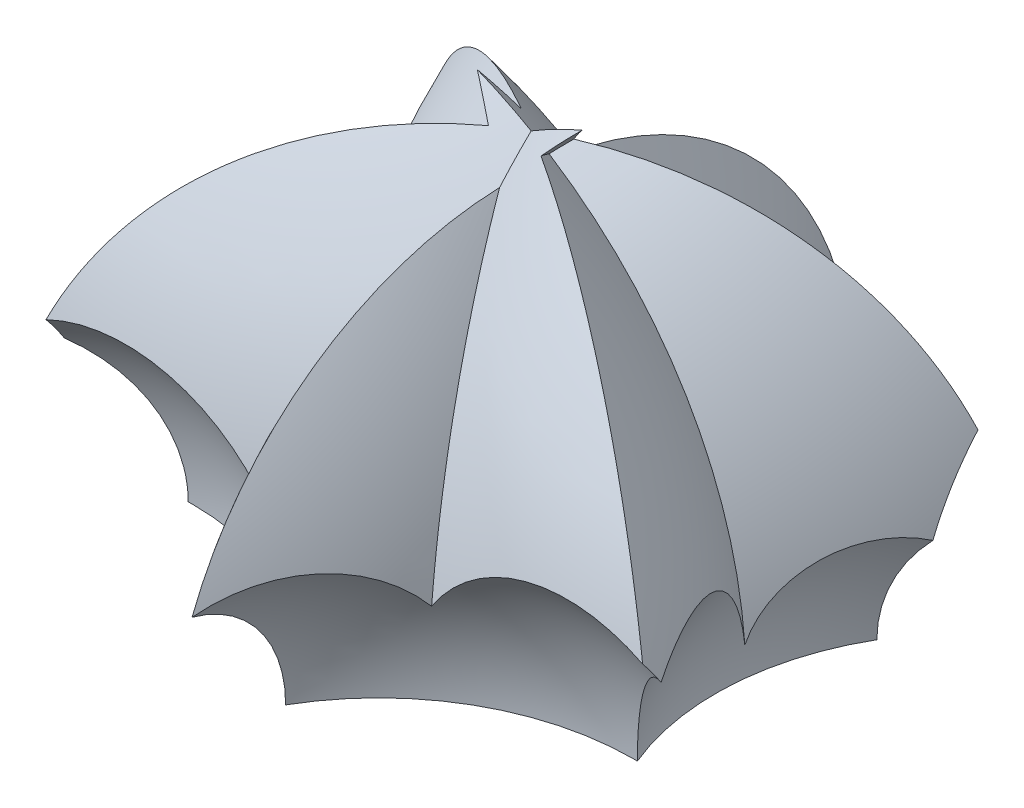
ISO-10303-21;
HEADER;
FILE_DESCRIPTION(('STEP AP214'),'2;1');
FILE_NAME('part.step','',(''),(''),'','','');
FILE_SCHEMA(('AUTOMOTIVE_DESIGN { 1 0 10303 214 1 1 1 1 }'));
ENDSEC;
DATA;
#1=APPLICATION_CONTEXT('core data for automotive mechanical design processes');
#2=APPLICATION_PROTOCOL_DEFINITION('international standard','automotive_design',2000,#1);
#3=PRODUCT_CONTEXT('',#1,'mechanical');
#4=PRODUCT('Part','Part','',(#3));
#5=PRODUCT_RELATED_PRODUCT_CATEGORY('part','',(#4));
#6=PRODUCT_DEFINITION_FORMATION('','',#4);
#7=PRODUCT_DEFINITION_CONTEXT('part definition',#1,'design');
#8=PRODUCT_DEFINITION('design','',#6,#7);
#9=PRODUCT_DEFINITION_SHAPE('','',#8);
#10=(LENGTH_UNIT() NAMED_UNIT(*) SI_UNIT(.MILLI.,.METRE.));
#11=(NAMED_UNIT(*) PLANE_ANGLE_UNIT() SI_UNIT($,.RADIAN.));
#12=(NAMED_UNIT(*) SI_UNIT($,.STERADIAN.) SOLID_ANGLE_UNIT());
#13=UNCERTAINTY_MEASURE_WITH_UNIT(LENGTH_MEASURE(1.E-05),#10,'distance_accuracy_value','');
#14=(GEOMETRIC_REPRESENTATION_CONTEXT(3) GLOBAL_UNCERTAINTY_ASSIGNED_CONTEXT((#13)) GLOBAL_UNIT_ASSIGNED_CONTEXT((#10,
#11,#12)) REPRESENTATION_CONTEXT('',''));
#15=CARTESIAN_POINT('',(0.,0.,0.));
#16=DIRECTION('',(0.,0.,1.));
#17=DIRECTION('',(1.,0.,0.));
#18=AXIS2_PLACEMENT_3D('',#15,#16,#17);
#19=CARTESIAN_POINT('',(43.3012716188138,0.,69.1922986540517));
#20=DIRECTION('',(0.,0.,-1.));
#21=DIRECTION('',(1.,0.,0.));
#22=AXIS2_PLACEMENT_3D('',#19,#20,#21);
#23=SPHERICAL_SURFACE('',#22,50.0000005);
#24=CARTESIAN_POINT('',(1.21308541684018E-06,0.,69.1922987790518));
#25=DIRECTION('',(1.,0.,-2.88675413431548E-09));
#26=DIRECTION('',(-2.88675413431548E-09,0.,-1.));
#27=AXIS2_PLACEMENT_3D('',#24,#25,#26);
#28=CIRCLE('',#27,25.0000006249999);
#29=CARTESIAN_POINT('',(1.14091655867667E-06,0.,44.1922981540519));
#30=VERTEX_POINT('',#29);
#31=CARTESIAN_POINT('',(-1.12754845738028E-06,24.112904785024,62.5917190299954));
#32=VERTEX_POINT('',#31);
#33=EDGE_CURVE('E179',#30,#32,#28,.T.);
#34=ORIENTED_EDGE('',*,*,#33,.F.);
#35=CARTESIAN_POINT('',(43.3012716188138,0.,69.1922986540517));
#36=DIRECTION('',(0.,1.,0.));
#37=DIRECTION('',(0.,0.,1.));
#38=AXIS2_PLACEMENT_3D('',#35,#36,#37);
#39=CIRCLE('',#38,50.0000005);
#40=CARTESIAN_POINT('',(44.1497698544268,0.,19.1994981649396));
#41=VERTEX_POINT('',#40);
#42=EDGE_CURVE('E180',#30,#41,#39,.F.);
#43=ORIENTED_EDGE('',*,*,#42,.T.);
#44=CARTESIAN_POINT('',(66.8089526744641,0.,34.596149325747));
#45=DIRECTION('',(-0.562020611646375,0.,0.82712322666253));
#46=DIRECTION('',(0.82712322666253,0.,0.562020611646375));
#47=AXIS2_PLACEMENT_3D('',#44,#45,#46);
#48=CIRCLE('',#47,27.3951717103483);
#49=CARTESIAN_POINT('',(58.6371372298961,25.5516125522237,29.043495783482));
#50=VERTEX_POINT('',#49);
#51=EDGE_CURVE('E166',#50,#41,#48,.T.);
#52=ORIENTED_EDGE('',*,*,#51,.F.);
#53=CARTESIAN_POINT('',(58.6371373457959,0.,69.1922986097808));
#54=DIRECTION('',(1.,0.,-2.88675413431548E-09));
#55=DIRECTION('',(-2.88675413431548E-09,0.,-1.));
#56=AXIS2_PLACEMENT_3D('',#53,#54,#55);
#57=CIRCLE('',#56,47.5900333305617);
#58=CARTESIAN_POINT('',(58.6371372403392,30.500492086637,32.6610619091574));
#59=VERTEX_POINT('',#58);
#60=EDGE_CURVE('E277',#50,#59,#57,.T.);
#61=ORIENTED_EDGE('',*,*,#60,.T.);
#62=CARTESIAN_POINT('',(44.2517840873981,0.,32.2905253116345));
#63=DIRECTION('',(-0.0257493670676135,0.,0.999668430078502));
#64=DIRECTION('',(0.999668430078502,0.,0.0257493670676135));
#65=AXIS2_PLACEMENT_3D('',#62,#63,#64);
#66=CIRCLE('',#65,33.724704598142);
#67=CARTESIAN_POINT('',(16.0670182560534,18.5053405113417,31.5645447171998));
#68=VERTEX_POINT('',#67);
#69=EDGE_CURVE('E272',#59,#68,#66,.T.);
#70=ORIENTED_EDGE('',*,*,#69,.T.);
#71=CARTESIAN_POINT('',(6.46090847108671,0.,50.1149949064991));
#72=DIRECTION('',(0.888001707176477,0.,0.459840154892613));
#73=DIRECTION('',(0.459840154892613,0.,-0.888001707176477));
#74=AXIS2_PLACEMENT_3D('',#71,#72,#73);
#75=CIRCLE('',#74,27.9077798269086);
#76=EDGE_CURVE('E287',#68,#32,#75,.T.);
#77=ORIENTED_EDGE('',*,*,#76,.T.);
#78=EDGE_LOOP('',(#34,#43,#52,#61,#70,#77));
#79=FACE_BOUND('',#78,.T.);
#80=ADVANCED_FACE('F35',(#79),#23,.F.);
#81=CARTESIAN_POINT('',(-43.3012691926429,0.,69.1922989040519));
#82=DIRECTION('',(0.,0.,-1.));
#83=DIRECTION('',(1.,0.,0.));
#84=AXIS2_PLACEMENT_3D('',#81,#82,#83);
#85=SPHERICAL_SURFACE('',#84,50.0000005);
#86=CARTESIAN_POINT('',(-66.8089525889271,0.,34.5961494507471));
#87=DIRECTION('',(0.562020648541057,0.,0.827123201593021));
#88=DIRECTION('',(0.827123201593021,0.,-0.562020648541057));
#89=AXIS2_PLACEMENT_3D('',#86,#87,#88);
#90=CIRCLE('',#89,27.3951695440029);
#91=CARTESIAN_POINT('',(-44.1497722475078,0.,19.1994984967344));
#92=VERTEX_POINT('',#91);
#93=CARTESIAN_POINT('',(-58.6371350355248,25.5516091279593,29.0434939427444));
#94=VERTEX_POINT('',#93);
#95=EDGE_CURVE('E172',#92,#94,#90,.T.);
#96=ORIENTED_EDGE('',*,*,#95,.F.);
#97=CARTESIAN_POINT('',(-43.3012691926429,0.,69.1922989040519));
#98=DIRECTION('',(0.,1.,0.));
#99=DIRECTION('',(0.,0.,1.));
#100=AXIS2_PLACEMENT_3D('',#97,#98,#99);
#101=CIRCLE('',#100,50.0000005);
#102=EDGE_CURVE('E186',#92,#30,#101,.F.);
#103=ORIENTED_EDGE('',*,*,#102,.T.);
#104=ORIENTED_EDGE('',*,*,#33,.T.);
#105=CARTESIAN_POINT('',(-6.46090894567249,0.,50.1149959213216));
#106=DIRECTION('',(-0.888001699919546,0.,0.459840168906541));
#107=DIRECTION('',(0.459840168906542,0.,0.888001699919546));
#108=AXIS2_PLACEMENT_3D('',#105,#106,#107);
#109=CIRCLE('',#108,27.9077841789444);
#110=CARTESIAN_POINT('',(-16.0670201044553,18.505344420697,31.5645437959681));
#111=VERTEX_POINT('',#110);
#112=EDGE_CURVE('E285',#32,#111,#109,.T.);
#113=ORIENTED_EDGE('',*,*,#112,.T.);
#114=CARTESIAN_POINT('',(-44.251782756101,0.,32.2905251363745));
#115=DIRECTION('',(0.0257493964115152,0.,0.999668429322664));
#116=DIRECTION('',(0.999668429322664,0.,-0.0257493964115152));
#117=AXIS2_PLACEMENT_3D('',#114,#115,#116);
#118=CIRCLE('',#117,33.7247041019613);
#119=CARTESIAN_POINT('',(-58.6371350250817,30.5004919500622,32.661062133671));
#120=VERTEX_POINT('',#119);
#121=EDGE_CURVE('E270',#111,#120,#118,.T.);
#122=ORIENTED_EDGE('',*,*,#121,.T.);
#123=CARTESIAN_POINT('',(-58.637134919625,0.,69.1922989483228));
#124=DIRECTION('',(-1.,0.,2.88675413431548E-09));
#125=DIRECTION('',(2.88675413431548E-09,0.,1.));
#126=AXIS2_PLACEMENT_3D('',#123,#124,#125);
#127=CIRCLE('',#126,47.5900333305617);
#128=EDGE_CURVE('E282',#120,#94,#127,.T.);
#129=ORIENTED_EDGE('',*,*,#128,.T.);
#130=EDGE_LOOP('',(#96,#103,#104,#113,#122,#129));
#131=FACE_BOUND('',#130,.T.);
#132=ADVANCED_FACE('F311',(#131),#85,.F.);
#133=CARTESIAN_POINT('',(-90.3166359834734,0.,0.));
#134=DIRECTION('',(0.,0.,-1.));
#135=DIRECTION('',(1.,0.,0.));
#136=AXIS2_PLACEMENT_3D('',#133,#134,#135);
#137=SPHERICAL_SURFACE('',#136,50.0000004974132);
#138=CARTESIAN_POINT('',(-68.6660006731029,0.,-37.5000003724132));
#139=DIRECTION('',(-0.500000000012934,0.,0.866025403776971));
#140=DIRECTION('',(0.866025403776971,0.,0.500000000012934));
#141=AXIS2_PLACEMENT_3D('',#138,#139,#140);
#142=CIRCLE('',#141,25.0000002493533);
#143=CARTESIAN_POINT('',(-47.0153653627323,0.,-25.0000002474132));
#144=VERTEX_POINT('',#143);
#145=CARTESIAN_POINT('',(-54.0049527589685,18.3957851479263,-29.0354404122938));
#146=VERTEX_POINT('',#145);
#147=EDGE_CURVE('E171',#144,#146,#142,.T.);
#148=ORIENTED_EDGE('',*,*,#147,.F.);
#149=CARTESIAN_POINT('',(-90.3166359834734,0.,0.));
#150=DIRECTION('',(0.,1.,0.));
#151=DIRECTION('',(0.,0.,1.));
#152=AXIS2_PLACEMENT_3D('',#149,#150,#151);
#153=CIRCLE('',#152,50.0000004974132);
#154=EDGE_CURVE('E167',#144,#92,#153,.F.);
#155=ORIENTED_EDGE('',*,*,#154,.T.);
#156=ORIENTED_EDGE('',*,*,#95,.T.);
#157=CARTESIAN_POINT('',(-53.4762728365096,0.,19.0773037471573));
#158=DIRECTION('',(-0.888001707176477,0.,-0.459840154892613));
#159=DIRECTION('',(-0.459840154892613,0.,0.888001707176477));
#160=AXIS2_PLACEMENT_3D('',#157,#158,#159);
#161=CIRCLE('',#160,27.9077798235519);
#162=CARTESIAN_POINT('',(-40.9451351537225,6.01857031945143,-5.12169570250389));
#163=VERTEX_POINT('',#162);
#164=EDGE_CURVE('E280',#94,#163,#161,.T.);
#165=ORIENTED_EDGE('',*,*,#164,.T.);
#166=CARTESIAN_POINT('',(-50.1328428906324,0.,-21.9452459181186));
#167=DIRECTION('',(-0.877649269972977,0.,0.479303410081652));
#168=DIRECTION('',(0.479303410081652,0.,0.877649269972977));
#169=AXIS2_PLACEMENT_3D('',#166,#167,#168);
#170=CIRCLE('',#169,20.091515721975);
#171=EDGE_CURVE('E265',#163,#146,#170,.T.);
#172=ORIENTED_EDGE('',*,*,#171,.T.);
#173=EDGE_LOOP('',(#148,#155,#156,#165,#172));
#174=FACE_BOUND('',#173,.T.);
#175=ADVANCED_FACE('F317',(#174),#137,.F.);
#176=CARTESIAN_POINT('',(90.3166337283765,0.,0.));
#177=DIRECTION('',(0.,0.,-1.));
#178=DIRECTION('',(1.,0.,0.));
#179=AXIS2_PLACEMENT_3D('',#176,#177,#178);
#180=SPHERICAL_SURFACE('',#179,50.0000004974132);
#181=ORIENTED_EDGE('',*,*,#51,.T.);
#182=CARTESIAN_POINT('',(90.3166337283765,0.,0.));
#183=DIRECTION('',(0.,1.,0.));
#184=DIRECTION('',(0.,0.,1.));
#185=AXIS2_PLACEMENT_3D('',#182,#183,#184);
#186=CIRCLE('',#185,50.0000004974132);
#187=CARTESIAN_POINT('',(47.0153629632976,0.,-24.999999997413));
#188=VERTEX_POINT('',#187);
#189=EDGE_CURVE('E151',#41,#188,#186,.F.);
#190=ORIENTED_EDGE('',*,*,#189,.T.);
#191=CARTESIAN_POINT('',(68.6659986345122,0.,-37.5000002474131));
#192=DIRECTION('',(0.499999997512936,0.,0.866025405220346));
#193=DIRECTION('',(0.866025405220346,0.,-0.499999997512936));
#194=AXIS2_PLACEMENT_3D('',#191,#192,#193);
#195=CIRCLE('',#194,25.0000006243534);
#196=CARTESIAN_POINT('',(54.0049506924714,18.3957856538653,-29.0354403276122));
#197=VERTEX_POINT('',#196);
#198=EDGE_CURVE('E162',#197,#188,#195,.T.);
#199=ORIENTED_EDGE('',*,*,#198,.F.);
#200=CARTESIAN_POINT('',(50.132840856963,0.,-21.9452459395372));
#201=DIRECTION('',(0.877649268665169,0.,0.47930341247637));
#202=DIRECTION('',(0.47930341247637,0.,-0.877649268665169));
#203=AXIS2_PLACEMENT_3D('',#200,#201,#202);
#204=CIRCLE('',#203,20.0915161414437);
#205=CARTESIAN_POINT('',(40.9451344153363,6.0185806318794,-5.12169820483079));
#206=VERTEX_POINT('',#205);
#207=EDGE_CURVE('E253',#197,#206,#204,.T.);
#208=ORIENTED_EDGE('',*,*,#207,.T.);
#209=CARTESIAN_POINT('',(53.4762734821693,0.,19.077302982335));
#210=DIRECTION('',(0.888001699919546,0.,-0.459840168906541));
#211=DIRECTION('',(-0.459840168906542,0.,-0.888001699919546));
#212=AXIS2_PLACEMENT_3D('',#209,#210,#211);
#213=CIRCLE('',#212,27.9077841755878);
#214=EDGE_CURVE('E275',#206,#50,#213,.T.);
#215=ORIENTED_EDGE('',*,*,#214,.T.);
#216=EDGE_LOOP('',(#181,#190,#199,#208,#215));
#217=FACE_BOUND('',#216,.T.);
#218=ADVANCED_FACE('F160',(#217),#180,.F.);
#219=CARTESIAN_POINT('',(-47.0153653612388,0.,-75.0000007474132));
#220=DIRECTION('',(0.,0.,-1.));
#221=DIRECTION('',(1.,0.,0.));
#222=AXIS2_PLACEMENT_3D('',#219,#220,#221);
#223=SPHERICAL_SURFACE('',#222,50.0000005);
#224=CARTESIAN_POINT('',(-9.11042193074696E-07,0.,-75.0000006224131));
#225=DIRECTION('',(1.,0.,2.65870805779152E-09));
#226=DIRECTION('',(2.65870805779152E-09,0.,-1.));
#227=AXIS2_PLACEMENT_3D('',#224,#225,#226);
#228=CIRCLE('',#227,17.0163320258859);
#229=CARTESIAN_POINT('',(-1.12754845781396E-06,14.1604185706604,-65.5639993762218));
#230=VERTEX_POINT('',#229);
#231=CARTESIAN_POINT('',(-9.56283654287028E-07,0.,-57.9836685965272));
#232=VERTEX_POINT('',#231);
#233=EDGE_CURVE('E174',#230,#232,#228,.T.);
#234=ORIENTED_EDGE('',*,*,#233,.T.);
#235=CARTESIAN_POINT('',(-47.0153653612388,0.,-75.0000007474132));
#236=DIRECTION('',(0.,1.,0.));
#237=DIRECTION('',(0.,0.,1.));
#238=AXIS2_PLACEMENT_3D('',#235,#236,#237);
#239=CIRCLE('',#238,50.0000005);
#240=EDGE_CURVE('E50',#232,#144,#239,.F.);
#241=ORIENTED_EDGE('',*,*,#240,.T.);
#242=ORIENTED_EDGE('',*,*,#147,.T.);
#243=CARTESIAN_POINT('',(-54.0049526367622,0.,-75.0000007659965));
#244=DIRECTION('',(-1.,0.,-2.65870805779152E-09));
#245=DIRECTION('',(-2.65870805779152E-09,0.,1.));
#246=AXIS2_PLACEMENT_3D('',#243,#244,#245);
#247=CIRCLE('',#246,49.509046847196);
#248=CARTESIAN_POINT('',(-54.004952735417,32.7760375149458,-37.8937063601049));
#249=VERTEX_POINT('',#248);
#250=EDGE_CURVE('E262',#146,#249,#247,.T.);
#251=ORIENTED_EDGE('',*,*,#250,.T.);
#252=CARTESIAN_POINT('',(-46.0648517977808,0.,-38.0982269797359));
#253=DIRECTION('',(-0.0257493964115152,0.,-0.999668429322664));
#254=DIRECTION('',(-0.999668429322664,0.,0.0257493964115152));
#255=AXIS2_PLACEMENT_3D('',#252,#253,#254);
#256=CIRCLE('',#255,33.7247041019613);
#257=CARTESIAN_POINT('',(-14.5564305705597,11.9965152054392,-38.9098189083021));
#258=VERTEX_POINT('',#257);
#259=EDGE_CURVE('E268',#249,#258,#256,.T.);
#260=ORIENTED_EDGE('',*,*,#259,.T.);
#261=CARTESIAN_POINT('',(-6.83157248909989,0.,-53.0547548074798));
#262=DIRECTION('',(-0.877649268665169,0.,-0.47930341247637));
#263=DIRECTION('',(-0.47930341247637,0.,0.877649268665169));
#264=AXIS2_PLACEMENT_3D('',#261,#262,#263);
#265=CIRCLE('',#264,20.0915161459975);
#266=EDGE_CURVE('E260',#258,#230,#265,.T.);
#267=ORIENTED_EDGE('',*,*,#266,.T.);
#268=EDGE_LOOP('',(#234,#241,#242,#251,#260,#267));
#269=FACE_BOUND('',#268,.T.);
#270=ADVANCED_FACE('F289',(#269),#223,.F.);
#271=CARTESIAN_POINT('',(47.0153635391544,0.,-75.000000497413));
#272=DIRECTION('',(0.,0.,-1.));
#273=DIRECTION('',(1.,0.,0.));
#274=AXIS2_PLACEMENT_3D('',#271,#272,#273);
#275=SPHERICAL_SURFACE('',#274,50.0000005);
#276=ORIENTED_EDGE('',*,*,#198,.T.);
#277=CARTESIAN_POINT('',(47.0153635391544,0.,-75.000000497413));
#278=DIRECTION('',(0.,1.,0.));
#279=DIRECTION('',(0.,0.,1.));
#280=AXIS2_PLACEMENT_3D('',#277,#278,#279);
#281=CIRCLE('',#280,50.0000005);
#282=EDGE_CURVE('E11',#188,#232,#281,.F.);
#283=ORIENTED_EDGE('',*,*,#282,.T.);
#284=ORIENTED_EDGE('',*,*,#233,.F.);
#285=CARTESIAN_POINT('',(6.83157044558798,0.,-53.0547545788982));
#286=DIRECTION('',(0.877649269972977,0.,-0.479303410081652));
#287=DIRECTION('',(-0.479303410081652,0.,-0.877649269972977));
#288=AXIS2_PLACEMENT_3D('',#285,#286,#287);
#289=CIRCLE('',#288,20.0915157265288);
#290=CARTESIAN_POINT('',(14.5564287463999,11.9965137799094,-38.9098181863168));
#291=VERTEX_POINT('',#290);
#292=EDGE_CURVE('E257',#230,#291,#289,.T.);
#293=ORIENTED_EDGE('',*,*,#292,.T.);
#294=CARTESIAN_POINT('',(46.0648510705701,0.,-38.0982271549958));
#295=DIRECTION('',(0.0257493670676135,0.,-0.999668430078502));
#296=DIRECTION('',(-0.999668430078502,0.,-0.0257493670676135));
#297=AXIS2_PLACEMENT_3D('',#294,#295,#296);
#298=CIRCLE('',#297,33.724704598142);
#299=CARTESIAN_POINT('',(54.004950716023,32.7760383401865,-37.8937068018742));
#300=VERTEX_POINT('',#299);
#301=EDGE_CURVE('E255',#291,#300,#298,.T.);
#302=ORIENTED_EDGE('',*,*,#301,.T.);
#303=CARTESIAN_POINT('',(54.0049508146778,0.,-75.0000004788297));
#304=DIRECTION('',(1.,0.,2.65870805779152E-09));
#305=DIRECTION('',(2.65870805779152E-09,0.,-1.));
#306=AXIS2_PLACEMENT_3D('',#303,#304,#305);
#307=CIRCLE('',#306,49.5090468471959);
#308=EDGE_CURVE('E170',#300,#197,#307,.T.);
#309=ORIENTED_EDGE('',*,*,#308,.T.);
#310=EDGE_LOOP('',(#276,#283,#284,#293,#302,#309));
#311=FACE_BOUND('',#310,.T.);
#312=ADVANCED_FACE('F37',(#311),#275,.F.);
#313=CARTESIAN_POINT('',(-90.3166359834734,0.,0.));
#314=DIRECTION('',(0.,0.,-1.));
#315=DIRECTION('',(1.,0.,0.));
#316=AXIS2_PLACEMENT_3D('',#313,#314,#315);
#317=SPHERICAL_SURFACE('',#316,112.5);
#318=ORIENTED_EDGE('',*,*,#292,.F.);
#319=CARTESIAN_POINT('',(-1.12754845738028E-06,0.,0.));
#320=DIRECTION('',(1.,0.,0.));
#321=DIRECTION('',(0.,0.,-1.));
#322=AXIS2_PLACEMENT_3D('',#319,#320,#321);
#323=CIRCLE('',#322,67.0757442620022);
#324=CARTESIAN_POINT('',(-1.79546000289577E-06,66.2006085467591,-10.7997581312385));
#325=VERTEX_POINT('',#324);
#326=EDGE_CURVE('E195',#230,#325,#323,.T.);
#327=ORIENTED_EDGE('',*,*,#326,.T.);
#328=CARTESIAN_POINT('',(-23.5076821823298,0.,34.5961493270258));
#329=DIRECTION('',(-0.888001707176477,0.,-0.459840154892613));
#330=DIRECTION('',(-0.459840154892613,0.,0.888001707176477));
#331=AXIS2_PLACEMENT_3D('',#328,#329,#330);
#332=CIRCLE('',#331,83.6416172950929);
#333=EDGE_CURVE('E245',#325,#291,#332,.T.);
#334=ORIENTED_EDGE('',*,*,#333,.T.);
#335=EDGE_LOOP('',(#318,#327,#334));
#336=FACE_BOUND('',#335,.T.);
#337=ADVANCED_FACE('F298',(#336),#317,.T.);
#338=CARTESIAN_POINT('',(90.3166337283765,0.,0.));
#339=DIRECTION('',(0.,0.,-1.));
#340=DIRECTION('',(1.,0.,0.));
#341=AXIS2_PLACEMENT_3D('',#338,#339,#340);
#342=SPHERICAL_SURFACE('',#341,112.5);
#343=ORIENTED_EDGE('',*,*,#266,.F.);
#344=CARTESIAN_POINT('',(23.5076822678668,0.,34.5961494520259));
#345=DIRECTION('',(0.888001699919546,0.,-0.459840168906541));
#346=DIRECTION('',(-0.459840168906542,0.,-0.888001699919546));
#347=AXIS2_PLACEMENT_3D('',#344,#345,#346);
#348=CIRCLE('',#347,83.6416191129771);
#349=EDGE_CURVE('E242',#258,#325,#348,.T.);
#350=ORIENTED_EDGE('',*,*,#349,.T.);
#351=ORIENTED_EDGE('',*,*,#326,.F.);
#352=EDGE_LOOP('',(#343,#350,#351));
#353=FACE_BOUND('',#352,.T.);
#354=ADVANCED_FACE('F295',(#353),#342,.T.);
#355=CARTESIAN_POINT('',(-43.3012691926429,0.,69.1922989040519));
#356=DIRECTION('',(0.,0.,-1.));
#357=DIRECTION('',(1.,0.,0.));
#358=AXIS2_PLACEMENT_3D('',#355,#356,#357);
#359=SPHERICAL_SURFACE('',#358,112.5);
#360=ORIENTED_EDGE('',*,*,#259,.F.);
#361=CARTESIAN_POINT('',(1.85704717325575,0.,-2.90385079668053));
#362=DIRECTION('',(-0.530828955600346,0.,0.847478979029124));
#363=DIRECTION('',(0.847478979029124,0.,0.530828955600346));
#364=AXIS2_PLACEMENT_3D('',#361,#362,#363);
#365=CIRCLE('',#364,73.6146837344764);
#366=CARTESIAN_POINT('',(-5.15581541699393,73.1481137371967,-7.296444143144));
#367=VERTEX_POINT('',#366);
#368=EDGE_CURVE('E194',#367,#249,#365,.T.);
#369=ORIENTED_EDGE('',*,*,#368,.F.);
#370=CARTESIAN_POINT('',(-66.8089525880582,0.,34.596149452026));
#371=DIRECTION('',(0.562020648541057,0.,0.827123201593021));
#372=DIRECTION('',(0.827123201593021,0.,-0.562020648541057));
#373=AXIS2_PLACEMENT_3D('',#370,#371,#372);
#374=CIRCLE('',#373,104.435364051044);
#375=CARTESIAN_POINT('',(-10.2989306873646,78.9871096087297,-3.80175680489981));
#376=VERTEX_POINT('',#375);
#377=EDGE_CURVE('E199',#367,#376,#374,.T.);
#378=ORIENTED_EDGE('',*,*,#377,.T.);
#379=CARTESIAN_POINT('',(-45.1583172769409,0.,-2.90385092168069));
#380=DIRECTION('',(0.0257493964115152,0.,0.999668429322664));
#381=DIRECTION('',(0.999668429322664,0.,-0.0257493964115152));
#382=AXIS2_PLACEMENT_3D('',#379,#380,#381);
#383=CIRCLE('',#382,86.3420323638385);
#384=CARTESIAN_POINT('',(-1.09963224719308E-06,73.582062041112,-4.06703472225405));
#385=VERTEX_POINT('',#384);
#386=EDGE_CURVE('E204',#385,#376,#383,.T.);
#387=ORIENTED_EDGE('',*,*,#386,.F.);
#388=CARTESIAN_POINT('',(1.21308541684018E-06,0.,69.1922987790518));
#389=DIRECTION('',(-1.,0.,2.88675413431548E-09));
#390=DIRECTION('',(2.88675413431548E-09,0.,1.));
#391=AXIS2_PLACEMENT_3D('',#388,#389,#390);
#392=CIRCLE('',#391,103.832798196187);
#393=EDGE_CURVE('E196',#385,#325,#392,.T.);
#394=ORIENTED_EDGE('',*,*,#393,.T.);
#395=ORIENTED_EDGE('',*,*,#349,.F.);
#396=EDGE_LOOP('',(#360,#369,#378,#387,#394,#395));
#397=FACE_BOUND('',#396,.T.);
#398=ADVANCED_FACE('F428',(#397),#359,.T.);
#399=CARTESIAN_POINT('',(43.3012716188138,0.,69.1922986540517));
#400=DIRECTION('',(0.,0.,-1.));
#401=DIRECTION('',(1.,0.,0.));
#402=AXIS2_PLACEMENT_3D('',#399,#400,#401);
#403=SPHERICAL_SURFACE('',#402,112.5);
#404=ORIENTED_EDGE('',*,*,#301,.F.);
#405=ORIENTED_EDGE('',*,*,#333,.F.);
#406=ORIENTED_EDGE('',*,*,#393,.F.);
#407=CARTESIAN_POINT('',(45.1583175789841,0.,-2.90385092168065));
#408=DIRECTION('',(0.0257493670676135,0.,-0.999668430078502));
#409=DIRECTION('',(-0.999668430078502,0.,-0.0257493670676135));
#410=AXIS2_PLACEMENT_3D('',#407,#408,#409);
#411=CIRCLE('',#410,86.3420326182761);
#412=CARTESIAN_POINT('',(10.2989268857513,78.9871080862304,-3.8017558866728));
#413=VERTEX_POINT('',#412);
#414=EDGE_CURVE('E219',#385,#413,#411,.T.);
#415=ORIENTED_EDGE('',*,*,#414,.T.);
#416=CARTESIAN_POINT('',(66.8089526735951,0.,34.5961493270258));
#417=DIRECTION('',(0.562020611646375,0.,-0.82712322666253));
#418=DIRECTION('',(-0.82712322666253,0.,-0.562020611646375));
#419=AXIS2_PLACEMENT_3D('',#416,#417,#418);
#420=CIRCLE('',#419,104.435364619313);
#421=CARTESIAN_POINT('',(5.15581227410643,73.148112873298,-7.29644244198509));
#422=VERTEX_POINT('',#421);
#423=EDGE_CURVE('E223',#422,#413,#420,.T.);
#424=ORIENTED_EDGE('',*,*,#423,.F.);
#425=CARTESIAN_POINT('',(-1.85704687121252,0.,-2.90385104668077));
#426=DIRECTION('',(-0.530828973533444,0.,-0.847478967796505));
#427=DIRECTION('',(-0.847478967796505,0.,0.530828973533444));
#428=AXIS2_PLACEMENT_3D('',#425,#426,#427);
#429=CIRCLE('',#428,73.6146824314479);
#430=EDGE_CURVE('E246',#422,#300,#429,.T.);
#431=ORIENTED_EDGE('',*,*,#430,.T.);
#432=EDGE_LOOP('',(#404,#405,#406,#415,#424,#431));
#433=FACE_BOUND('',#432,.T.);
#434=ADVANCED_FACE('F302',(#433),#403,.T.);
#435=CARTESIAN_POINT('',(47.0153635391544,0.,-75.000000497413));
#436=DIRECTION('',(0.,0.,-1.));
#437=DIRECTION('',(-1.,0.,0.));
#438=AXIS2_PLACEMENT_3D('',#435,#436,#437);
#439=SPHERICAL_SURFACE('',#438,112.5);
#440=ORIENTED_EDGE('',*,*,#250,.F.);
#441=ORIENTED_EDGE('',*,*,#171,.F.);
#442=CARTESIAN_POINT('',(45.1583175789841,0.,-2.90385092168065));
#443=DIRECTION('',(0.0257493670676135,0.,-0.999668430078502));
#444=DIRECTION('',(-0.999668430078502,0.,-0.0257493670676135));
#445=AXIS2_PLACEMENT_3D('',#442,#443,#444);
#446=CIRCLE('',#445,86.3420326182761);
#447=CARTESIAN_POINT('',(-3.4405627167713,71.3549466661032,-4.1556563905321));
#448=VERTEX_POINT('',#447);
#449=EDGE_CURVE('E192',#163,#448,#446,.T.);
#450=ORIENTED_EDGE('',*,*,#449,.T.);
#451=CARTESIAN_POINT('',(-21.6506362221595,0.,-37.5000002487065));
#452=DIRECTION('',(-0.877649269972977,0.,0.479303410081652));
#453=DIRECTION('',(0.479303410081652,0.,0.877649269972977));
#454=AXIS2_PLACEMENT_3D('',#451,#452,#453);
#455=CIRCLE('',#454,80.8392259866845);
#456=EDGE_CURVE('E203',#448,#367,#455,.T.);
#457=ORIENTED_EDGE('',*,*,#456,.T.);
#458=ORIENTED_EDGE('',*,*,#368,.T.);
#459=EDGE_LOOP('',(#440,#441,#450,#457,#458));
#460=FACE_BOUND('',#459,.T.);
#461=ADVANCED_FACE('F413',(#460),#439,.T.);
#462=CARTESIAN_POINT('',(-90.3166359834734,0.,0.));
#463=DIRECTION('',(0.,0.,-1.));
#464=DIRECTION('',(1.,0.,0.));
#465=AXIS2_PLACEMENT_3D('',#462,#463,#464);
#466=SPHERICAL_SURFACE('',#465,112.5);
#467=CARTESIAN_POINT('',(-68.6660006723561,0.,-37.5000003737066));
#468=DIRECTION('',(-0.500000000012934,0.,0.866025403776971));
#469=DIRECTION('',(0.866025403776971,0.,0.500000000012934));
#470=AXIS2_PLACEMENT_3D('',#467,#468,#469);
#471=CIRCLE('',#470,103.832798106364);
#472=CARTESIAN_POINT('',(-5.16017575361181,73.5114292543955,-0.834895260495783));
#473=VERTEX_POINT('',#472);
#474=EDGE_CURVE('E200',#473,#376,#471,.T.);
#475=ORIENTED_EDGE('',*,*,#474,.T.);
#476=ORIENTED_EDGE('',*,*,#377,.F.);
#477=ORIENTED_EDGE('',*,*,#456,.F.);
#478=CARTESIAN_POINT('',(-23.5076821823298,0.,34.5961493270258));
#479=DIRECTION('',(-0.888001707176477,0.,-0.459840154892613));
#480=DIRECTION('',(-0.459840154892613,0.,0.888001707176477));
#481=AXIS2_PLACEMENT_3D('',#478,#479,#480);
#482=CIRCLE('',#481,83.6416172950929);
#483=EDGE_CURVE('E207',#473,#448,#482,.T.);
#484=ORIENTED_EDGE('',*,*,#483,.F.);
#485=EDGE_LOOP('',(#475,#476,#477,#484));
#486=FACE_BOUND('',#485,.T.);
#487=ADVANCED_FACE('F405',(#486),#466,.F.);
#488=CARTESIAN_POINT('',(-47.0153653612388,0.,-75.0000007474132));
#489=DIRECTION('',(0.,0.,-1.));
#490=DIRECTION('',(1.,0.,0.));
#491=AXIS2_PLACEMENT_3D('',#488,#489,#490);
#492=SPHERICAL_SURFACE('',#491,112.5);
#493=ORIENTED_EDGE('',*,*,#121,.F.);
#494=CARTESIAN_POINT('',(21.6506341835688,0.,-37.5000003737066));
#495=DIRECTION('',(0.877649268665169,0.,0.47930341247637));
#496=DIRECTION('',(0.47930341247637,0.,-0.877649268665169));
#497=AXIS2_PLACEMENT_3D('',#494,#495,#496);
#498=CIRCLE('',#497,80.8392261126025);
#499=CARTESIAN_POINT('',(-1.11614645019962E-06,67.0414596101125,2.14433292815198));
#500=VERTEX_POINT('',#499);
#501=EDGE_CURVE('E43',#500,#111,#498,.T.);
#502=ORIENTED_EDGE('',*,*,#501,.F.);
#503=CARTESIAN_POINT('',(-9.1104220001359E-07,0.,-75.0000006224131));
#504=DIRECTION('',(1.,0.,2.65870805779152E-09));
#505=DIRECTION('',(2.65870805779152E-09,0.,-1.));
#506=AXIS2_PLACEMENT_3D('',#503,#504,#505);
#507=CIRCLE('',#506,102.204723499529);
#508=EDGE_CURVE('E215',#385,#500,#507,.T.);
#509=ORIENTED_EDGE('',*,*,#508,.F.);
#510=ORIENTED_EDGE('',*,*,#386,.T.);
#511=ORIENTED_EDGE('',*,*,#474,.F.);
#512=CARTESIAN_POINT('',(-1.85704687121252,0.,-2.90385104668077));
#513=DIRECTION('',(-0.530828973533444,0.,-0.847478967796505));
#514=DIRECTION('',(-0.847478967796505,0.,0.530828973533444));
#515=AXIS2_PLACEMENT_3D('',#512,#513,#514);
#516=CIRCLE('',#515,73.6146824314479);
#517=EDGE_CURVE('E226',#120,#473,#516,.T.);
#518=ORIENTED_EDGE('',*,*,#517,.F.);
#519=EDGE_LOOP('',(#493,#502,#509,#510,#511,#518));
#520=FACE_BOUND('',#519,.T.);
#521=ADVANCED_FACE('F397',(#520),#492,.T.);
#522=CARTESIAN_POINT('',(90.3166337283765,0.,0.));
#523=DIRECTION('',(0.,0.,-1.));
#524=DIRECTION('',(1.,0.,0.));
#525=AXIS2_PLACEMENT_3D('',#522,#523,#524);
#526=SPHERICAL_SURFACE('',#525,112.5);
#527=ORIENTED_EDGE('',*,*,#112,.F.);
#528=CARTESIAN_POINT('',(-1.12754845738028E-06,0.,0.));
#529=DIRECTION('',(1.,0.,0.));
#530=DIRECTION('',(0.,0.,-1.));
#531=AXIS2_PLACEMENT_3D('',#528,#529,#530);
#532=CIRCLE('',#531,67.0757442620022);
#533=EDGE_CURVE('E231',#500,#32,#532,.T.);
#534=ORIENTED_EDGE('',*,*,#533,.F.);
#535=ORIENTED_EDGE('',*,*,#501,.T.);
#536=EDGE_LOOP('',(#527,#534,#535));
#537=FACE_BOUND('',#536,.T.);
#538=ADVANCED_FACE('F389',(#537),#526,.T.);
#539=CARTESIAN_POINT('',(47.0153635391544,0.,-75.000000497413));
#540=DIRECTION('',(0.,0.,-1.));
#541=DIRECTION('',(-1.,0.,0.));
#542=AXIS2_PLACEMENT_3D('',#539,#540,#541);
#543=SPHERICAL_SURFACE('',#542,112.5);
#544=ORIENTED_EDGE('',*,*,#69,.F.);
#545=CARTESIAN_POINT('',(1.85704717325575,0.,-2.90385079668053));
#546=DIRECTION('',(-0.530828955600346,0.,0.847478979029124));
#547=DIRECTION('',(0.847478979029124,0.,0.530828955600346));
#548=AXIS2_PLACEMENT_3D('',#545,#546,#547);
#549=CIRCLE('',#548,73.6146837344764);
#550=CARTESIAN_POINT('',(5.16017470692675,73.5114306463728,-0.834895952606385));
#551=VERTEX_POINT('',#550);
#552=EDGE_CURVE('E209',#59,#551,#549,.T.);
#553=ORIENTED_EDGE('',*,*,#552,.T.);
#554=CARTESIAN_POINT('',(68.6659986337655,0.,-37.5000002487065));
#555=DIRECTION('',(0.499999997512936,0.,0.866025405220346));
#556=DIRECTION('',(0.866025405220346,0.,-0.499999997512936));
#557=AXIS2_PLACEMENT_3D('',#554,#555,#556);
#558=CIRCLE('',#557,103.832798196654);
#559=EDGE_CURVE('E222',#413,#551,#558,.T.);
#560=ORIENTED_EDGE('',*,*,#559,.F.);
#561=ORIENTED_EDGE('',*,*,#414,.F.);
#562=ORIENTED_EDGE('',*,*,#508,.T.);
#563=CARTESIAN_POINT('',(-21.6506362221595,0.,-37.5000002487065));
#564=DIRECTION('',(-0.877649269972977,0.,0.479303410081652));
#565=DIRECTION('',(0.479303410081652,0.,0.877649269972977));
#566=AXIS2_PLACEMENT_3D('',#563,#564,#565);
#567=CIRCLE('',#566,80.8392259866845);
#568=EDGE_CURVE('E234',#68,#500,#567,.T.);
#569=ORIENTED_EDGE('',*,*,#568,.F.);
#570=EDGE_LOOP('',(#544,#553,#560,#561,#562,#569));
#571=FACE_BOUND('',#570,.T.);
#572=ADVANCED_FACE('F381',(#571),#543,.T.);
#573=CARTESIAN_POINT('',(-90.3166359834734,0.,0.));
#574=DIRECTION('',(0.,0.,-1.));
#575=DIRECTION('',(1.,0.,0.));
#576=AXIS2_PLACEMENT_3D('',#573,#574,#575);
#577=SPHERICAL_SURFACE('',#576,112.5);
#578=ORIENTED_EDGE('',*,*,#76,.F.);
#579=ORIENTED_EDGE('',*,*,#568,.T.);
#580=ORIENTED_EDGE('',*,*,#533,.T.);
#581=EDGE_LOOP('',(#578,#579,#580));
#582=FACE_BOUND('',#581,.T.);
#583=ADVANCED_FACE('F373',(#582),#577,.T.);
#584=CARTESIAN_POINT('',(43.3012716188138,0.,69.1922986540517));
#585=DIRECTION('',(0.,0.,-1.));
#586=DIRECTION('',(1.,0.,0.));
#587=AXIS2_PLACEMENT_3D('',#584,#585,#586);
#588=SPHERICAL_SURFACE('',#587,112.5);
#589=ORIENTED_EDGE('',*,*,#164,.F.);
#590=ORIENTED_EDGE('',*,*,#128,.F.);
#591=ORIENTED_EDGE('',*,*,#517,.T.);
#592=ORIENTED_EDGE('',*,*,#483,.T.);
#593=ORIENTED_EDGE('',*,*,#449,.F.);
#594=EDGE_LOOP('',(#589,#590,#591,#592,#593));
#595=FACE_BOUND('',#594,.T.);
#596=ADVANCED_FACE('F366',(#595),#588,.T.);
#597=CARTESIAN_POINT('',(90.3166337283765,0.,0.));
#598=DIRECTION('',(0.,0.,-1.));
#599=DIRECTION('',(1.,0.,0.));
#600=AXIS2_PLACEMENT_3D('',#597,#598,#599);
#601=SPHERICAL_SURFACE('',#600,112.5);
#602=ORIENTED_EDGE('',*,*,#423,.T.);
#603=ORIENTED_EDGE('',*,*,#559,.T.);
#604=CARTESIAN_POINT('',(23.5076822678668,0.,34.5961494520259));
#605=DIRECTION('',(0.888001699919546,0.,-0.459840168906541));
#606=DIRECTION('',(-0.459840168906542,0.,-0.888001699919546));
#607=AXIS2_PLACEMENT_3D('',#604,#605,#606);
#608=CIRCLE('',#607,83.6416191129771);
#609=CARTESIAN_POINT('',(3.44056124645537,71.354947541112,-4.15565777238009));
#610=VERTEX_POINT('',#609);
#611=EDGE_CURVE('E216',#610,#551,#608,.T.);
#612=ORIENTED_EDGE('',*,*,#611,.F.);
#613=CARTESIAN_POINT('',(21.6506341835688,0.,-37.5000003737066));
#614=DIRECTION('',(0.877649268665169,0.,0.47930341247637));
#615=DIRECTION('',(0.47930341247637,0.,-0.877649268665169));
#616=AXIS2_PLACEMENT_3D('',#613,#614,#615);
#617=CIRCLE('',#616,80.8392261126025);
#618=EDGE_CURVE('E57',#422,#610,#617,.T.);
#619=ORIENTED_EDGE('',*,*,#618,.F.);
#620=EDGE_LOOP('',(#602,#603,#612,#619));
#621=FACE_BOUND('',#620,.T.);
#622=ADVANCED_FACE('F360',(#621),#601,.F.);
#623=CARTESIAN_POINT('',(-47.0153653612388,0.,-75.0000007474132));
#624=DIRECTION('',(0.,0.,-1.));
#625=DIRECTION('',(1.,0.,0.));
#626=AXIS2_PLACEMENT_3D('',#623,#624,#625);
#627=SPHERICAL_SURFACE('',#626,112.5);
#628=ORIENTED_EDGE('',*,*,#308,.F.);
#629=ORIENTED_EDGE('',*,*,#430,.F.);
#630=ORIENTED_EDGE('',*,*,#618,.T.);
#631=CARTESIAN_POINT('',(-45.1583172769409,0.,-2.90385092168069));
#632=DIRECTION('',(0.0257493964115152,0.,0.999668429322664));
#633=DIRECTION('',(0.999668429322664,0.,-0.0257493964115152));
#634=AXIS2_PLACEMENT_3D('',#631,#632,#633);
#635=CIRCLE('',#634,86.3420323638385);
#636=EDGE_CURVE('E213',#206,#610,#635,.T.);
#637=ORIENTED_EDGE('',*,*,#636,.F.);
#638=ORIENTED_EDGE('',*,*,#207,.F.);
#639=EDGE_LOOP('',(#628,#629,#630,#637,#638));
#640=FACE_BOUND('',#639,.T.);
#641=ADVANCED_FACE('F305',(#640),#627,.T.);
#642=CARTESIAN_POINT('',(-43.3012691926429,0.,69.1922989040519));
#643=DIRECTION('',(0.,0.,-1.));
#644=DIRECTION('',(1.,0.,0.));
#645=AXIS2_PLACEMENT_3D('',#642,#643,#644);
#646=SPHERICAL_SURFACE('',#645,112.5);
#647=ORIENTED_EDGE('',*,*,#214,.F.);
#648=ORIENTED_EDGE('',*,*,#636,.T.);
#649=ORIENTED_EDGE('',*,*,#611,.T.);
#650=ORIENTED_EDGE('',*,*,#552,.F.);
#651=ORIENTED_EDGE('',*,*,#60,.F.);
#652=EDGE_LOOP('',(#647,#648,#649,#650,#651));
#653=FACE_BOUND('',#652,.T.);
#654=ADVANCED_FACE('F308',(#653),#646,.T.);
#655=CARTESIAN_POINT('',(0.,0.,0.));
#656=DIRECTION('',(0.,1.,0.));
#657=DIRECTION('',(0.,0.,1.));
#658=AXIS2_PLACEMENT_3D('',#655,#656,#657);
#659=PLANE('',#658);
#660=ORIENTED_EDGE('',*,*,#102,.F.);
#661=ORIENTED_EDGE('',*,*,#154,.F.);
#662=ORIENTED_EDGE('',*,*,#240,.F.);
#663=ORIENTED_EDGE('',*,*,#282,.F.);
#664=ORIENTED_EDGE('',*,*,#189,.F.);
#665=ORIENTED_EDGE('',*,*,#42,.F.);
#666=EDGE_LOOP('',(#660,#661,#662,#663,#664,#665));
#667=FACE_BOUND('',#666,.T.);
#668=ADVANCED_FACE('F150',(#667),#659,.F.);
#669=CLOSED_SHELL('',(#80,#132,#175,#218,#270,#312,#337,#354,#398,#434,#461,#487,#521,#538,#572,
#583,#596,#622,#641,#654,#668));
#670=MANIFOLD_SOLID_BREP('B2',#669);
#671=ADVANCED_BREP_SHAPE_REPRESENTATION('',(#18,#670),#14);
#672=SHAPE_DEFINITION_REPRESENTATION(#9,#671);
ENDSEC;
END-ISO-10303-21;
